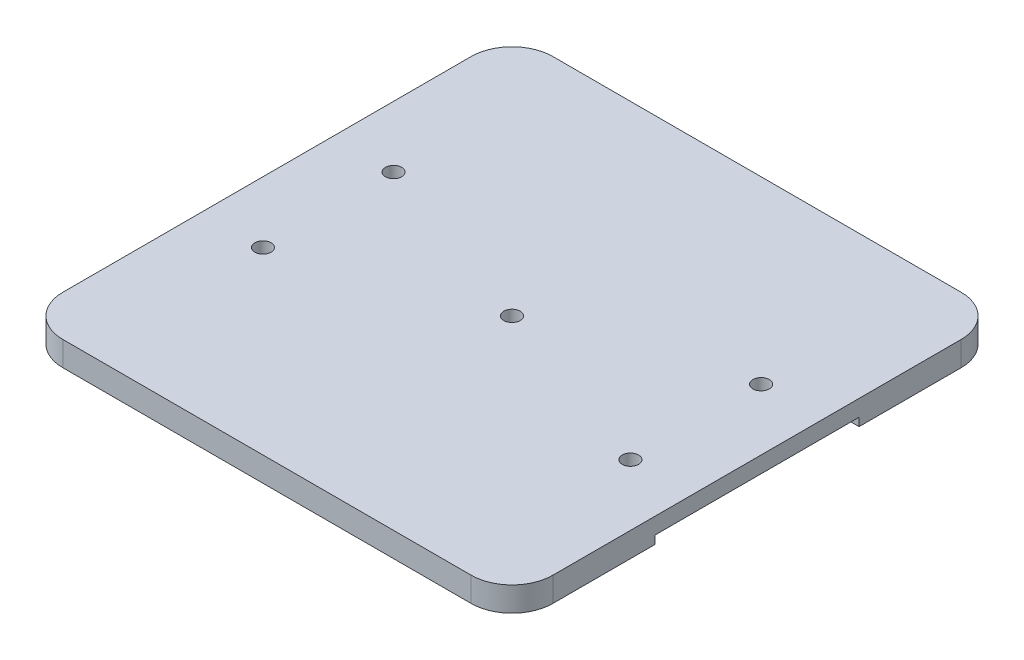
ISO-10303-21;
HEADER;
FILE_DESCRIPTION(('STEP AP214'),'2;1');
FILE_NAME('part.step','',(''),(''),'','','');
FILE_SCHEMA(('AUTOMOTIVE_DESIGN { 1 0 10303 214 1 1 1 1 }'));
ENDSEC;
DATA;
#1=APPLICATION_CONTEXT('core data for automotive mechanical design processes');
#2=APPLICATION_PROTOCOL_DEFINITION('international standard','automotive_design',2000,#1);
#3=PRODUCT_CONTEXT('',#1,'mechanical');
#4=PRODUCT('Part','Part','',(#3));
#5=PRODUCT_RELATED_PRODUCT_CATEGORY('part','',(#4));
#6=PRODUCT_DEFINITION_FORMATION('','',#4);
#7=PRODUCT_DEFINITION_CONTEXT('part definition',#1,'design');
#8=PRODUCT_DEFINITION('design','',#6,#7);
#9=PRODUCT_DEFINITION_SHAPE('','',#8);
#10=(LENGTH_UNIT() NAMED_UNIT(*) SI_UNIT(.MILLI.,.METRE.));
#11=(NAMED_UNIT(*) PLANE_ANGLE_UNIT() SI_UNIT($,.RADIAN.));
#12=(NAMED_UNIT(*) SI_UNIT($,.STERADIAN.) SOLID_ANGLE_UNIT());
#13=UNCERTAINTY_MEASURE_WITH_UNIT(LENGTH_MEASURE(1.E-05),#10,'distance_accuracy_value','');
#14=(GEOMETRIC_REPRESENTATION_CONTEXT(3) GLOBAL_UNCERTAINTY_ASSIGNED_CONTEXT((#13)) GLOBAL_UNIT_ASSIGNED_CONTEXT((#10,
#11,#12)) REPRESENTATION_CONTEXT('',''));
#15=CARTESIAN_POINT('',(0.,0.,0.));
#16=DIRECTION('',(0.,0.,1.));
#17=DIRECTION('',(1.,0.,0.));
#18=AXIS2_PLACEMENT_3D('',#15,#16,#17);
#19=CARTESIAN_POINT('',(-37.0588235294118,3.,-12.8235294117647));
#20=DIRECTION('',(1.,0.,0.));
#21=DIRECTION('',(0.,0.,-1.));
#22=AXIS2_PLACEMENT_3D('',#19,#20,#21);
#23=PLANE('',#22);
#24=DIRECTION('',(0.,-1.,0.));
#25=VECTOR('',#24,1.);
#26=CARTESIAN_POINT('',(-37.0588235294118,1.,24.6764705882353));
#27=LINE('',#26,#25);
#28=CARTESIAN_POINT('',(-37.0588235294118,1.,24.6764705882353));
#29=VERTEX_POINT('',#28);
#30=CARTESIAN_POINT('',(-37.0588235294118,0.,24.6764705882353));
#31=VERTEX_POINT('',#30);
#32=EDGE_CURVE('E172',#29,#31,#27,.T.);
#33=ORIENTED_EDGE('',*,*,#32,.T.);
#34=DIRECTION('',(0.,0.,1.));
#35=VECTOR('',#34,1.);
#36=CARTESIAN_POINT('',(-37.0588235294118,0.,-12.8235294117647));
#37=LINE('',#36,#35);
#38=CARTESIAN_POINT('',(-37.0588235294118,0.,37.1764705882353));
#39=VERTEX_POINT('',#38);
#40=EDGE_CURVE('E284',#31,#39,#37,.T.);
#41=ORIENTED_EDGE('',*,*,#40,.T.);
#42=DIRECTION('',(0.,-1.,0.));
#43=VECTOR('',#42,1.);
#44=CARTESIAN_POINT('',(-37.0588235294118,3.,37.1764705882353));
#45=LINE('',#44,#43);
#46=CARTESIAN_POINT('',(-37.0588235294118,3.,37.1764705882353));
#47=VERTEX_POINT('',#46);
#48=EDGE_CURVE('E316',#47,#39,#45,.T.);
#49=ORIENTED_EDGE('',*,*,#48,.F.);
#50=DIRECTION('',(0.,0.,1.));
#51=VECTOR('',#50,1.);
#52=CARTESIAN_POINT('',(-37.0588235294118,3.,-12.8235294117647));
#53=LINE('',#52,#51);
#54=CARTESIAN_POINT('',(-37.0588235294118,3.,-12.8235294117647));
#55=VERTEX_POINT('',#54);
#56=EDGE_CURVE('E259',#55,#47,#53,.T.);
#57=ORIENTED_EDGE('',*,*,#56,.F.);
#58=DIRECTION('',(0.,-1.,0.));
#59=VECTOR('',#58,1.);
#60=CARTESIAN_POINT('',(-37.0588235294118,3.,-12.8235294117647));
#61=LINE('',#60,#59);
#62=CARTESIAN_POINT('',(-37.0588235294118,0.,-12.8235294117647));
#63=VERTEX_POINT('',#62);
#64=EDGE_CURVE('E320',#55,#63,#61,.T.);
#65=ORIENTED_EDGE('',*,*,#64,.T.);
#66=CARTESIAN_POINT('',(-37.0588235294118,0.,-0.323529411764702));
#67=VERTEX_POINT('',#66);
#68=EDGE_CURVE('E285',#63,#67,#37,.T.);
#69=ORIENTED_EDGE('',*,*,#68,.T.);
#70=DIRECTION('',(0.,-1.,0.));
#71=VECTOR('',#70,1.);
#72=CARTESIAN_POINT('',(-37.0588235294118,1.,-0.323529411764702));
#73=LINE('',#72,#71);
#74=CARTESIAN_POINT('',(-37.0588235294118,1.,-0.323529411764702));
#75=VERTEX_POINT('',#74);
#76=EDGE_CURVE('E67',#75,#67,#73,.T.);
#77=ORIENTED_EDGE('',*,*,#76,.F.);
#78=DIRECTION('',(0.,0.,1.));
#79=VECTOR('',#78,1.);
#80=CARTESIAN_POINT('',(-37.0588235294118,1.,-0.323529411764702));
#81=LINE('',#80,#79);
#82=EDGE_CURVE('E165',#75,#29,#81,.T.);
#83=ORIENTED_EDGE('',*,*,#82,.T.);
#84=EDGE_LOOP('',(#33,#41,#49,#57,#65,#69,#77,#83));
#85=FACE_BOUND('',#84,.T.);
#86=ADVANCED_FACE('F43',(#85),#23,.F.);
#87=CARTESIAN_POINT('',(22.9411764705882,3.,-12.8235294117647));
#88=DIRECTION('',(-1.,0.,0.));
#89=DIRECTION('',(0.,0.,1.));
#90=AXIS2_PLACEMENT_3D('',#87,#88,#89);
#91=PLANE('',#90);
#92=DIRECTION('',(0.,-1.,0.));
#93=VECTOR('',#92,1.);
#94=CARTESIAN_POINT('',(22.9411764705882,1.,24.6764705882353));
#95=LINE('',#94,#93);
#96=CARTESIAN_POINT('',(22.9411764705882,1.,24.6764705882353));
#97=VERTEX_POINT('',#96);
#98=CARTESIAN_POINT('',(22.9411764705882,0.,24.6764705882353));
#99=VERTEX_POINT('',#98);
#100=EDGE_CURVE('E213',#97,#99,#95,.T.);
#101=ORIENTED_EDGE('',*,*,#100,.F.);
#102=DIRECTION('',(0.,0.,-1.));
#103=VECTOR('',#102,1.);
#104=CARTESIAN_POINT('',(22.9411764705882,1.,-0.323529411764702));
#105=LINE('',#104,#103);
#106=CARTESIAN_POINT('',(22.9411764705882,1.,-0.323529411764702));
#107=VERTEX_POINT('',#106);
#108=EDGE_CURVE('E238',#97,#107,#105,.T.);
#109=ORIENTED_EDGE('',*,*,#108,.T.);
#110=DIRECTION('',(0.,-1.,0.));
#111=VECTOR('',#110,1.);
#112=CARTESIAN_POINT('',(22.9411764705882,1.,-0.323529411764702));
#113=LINE('',#112,#111);
#114=CARTESIAN_POINT('',(22.9411764705882,0.,-0.323529411764702));
#115=VERTEX_POINT('',#114);
#116=EDGE_CURVE('E217',#107,#115,#113,.T.);
#117=ORIENTED_EDGE('',*,*,#116,.T.);
#118=DIRECTION('',(0.,0.,-1.));
#119=VECTOR('',#118,1.);
#120=CARTESIAN_POINT('',(22.9411764705882,0.,-12.8235294117647));
#121=LINE('',#120,#119);
#122=CARTESIAN_POINT('',(22.9411764705882,0.,-12.8235294117647));
#123=VERTEX_POINT('',#122);
#124=EDGE_CURVE('E297',#115,#123,#121,.T.);
#125=ORIENTED_EDGE('',*,*,#124,.T.);
#126=DIRECTION('',(0.,-1.,0.));
#127=VECTOR('',#126,1.);
#128=CARTESIAN_POINT('',(22.9411764705882,3.,-12.8235294117647));
#129=LINE('',#128,#127);
#130=CARTESIAN_POINT('',(22.9411764705882,3.,-12.8235294117647));
#131=VERTEX_POINT('',#130);
#132=EDGE_CURVE('E274',#131,#123,#129,.T.);
#133=ORIENTED_EDGE('',*,*,#132,.F.);
#134=DIRECTION('',(0.,0.,-1.));
#135=VECTOR('',#134,1.);
#136=CARTESIAN_POINT('',(22.9411764705882,3.,-12.8235294117647));
#137=LINE('',#136,#135);
#138=CARTESIAN_POINT('',(22.9411764705882,3.,37.1764705882353));
#139=VERTEX_POINT('',#138);
#140=EDGE_CURVE('E271',#139,#131,#137,.T.);
#141=ORIENTED_EDGE('',*,*,#140,.F.);
#142=DIRECTION('',(0.,-1.,0.));
#143=VECTOR('',#142,1.);
#144=CARTESIAN_POINT('',(22.9411764705882,3.,37.1764705882353));
#145=LINE('',#144,#143);
#146=CARTESIAN_POINT('',(22.9411764705882,0.,37.1764705882353));
#147=VERTEX_POINT('',#146);
#148=EDGE_CURVE('E304',#139,#147,#145,.T.);
#149=ORIENTED_EDGE('',*,*,#148,.T.);
#150=EDGE_CURVE('E253',#147,#99,#121,.T.);
#151=ORIENTED_EDGE('',*,*,#150,.T.);
#152=EDGE_LOOP('',(#101,#109,#117,#125,#133,#141,#149,#151));
#153=FACE_BOUND('',#152,.T.);
#154=ADVANCED_FACE('F367',(#153),#91,.F.);
#155=CARTESIAN_POINT('',(17.9411764705882,0.,-12.8235294117647));
#156=DIRECTION('',(0.,-1.,0.));
#157=DIRECTION('',(0.,0.,-1.));
#158=AXIS2_PLACEMENT_3D('',#155,#156,#157);
#159=PLANE('',#158);
#160=CARTESIAN_POINT('',(-7.05882352941178,0.,12.1764705882353));
#161=DIRECTION('',(0.,-1.,0.));
#162=DIRECTION('',(0.,0.,-1.));
#163=AXIS2_PLACEMENT_3D('',#160,#161,#162);
#164=CIRCLE('',#163,1.);
#165=CARTESIAN_POINT('',(-7.05882352941178,0.,11.1764705882353));
#166=VERTEX_POINT('',#165);
#167=EDGE_CURVE('E644',#166,#166,#164,.T.);
#168=ORIENTED_EDGE('',*,*,#167,.F.);
#169=EDGE_LOOP('',(#168));
#170=FACE_BOUND('',#169,.T.);
#171=ORIENTED_EDGE('',*,*,#40,.F.);
#172=DIRECTION('',(1.,0.,0.));
#173=VECTOR('',#172,1.);
#174=CARTESIAN_POINT('',(-37.0588235294118,0.,24.6764705882353));
#175=LINE('',#174,#173);
#176=CARTESIAN_POINT('',(-22.0588235294118,0.,24.6764705882353));
#177=VERTEX_POINT('',#176);
#178=EDGE_CURVE('E175',#31,#177,#175,.T.);
#179=ORIENTED_EDGE('',*,*,#178,.T.);
#180=DIRECTION('',(0.,0.,-1.));
#181=VECTOR('',#180,1.);
#182=CARTESIAN_POINT('',(-22.0588235294118,0.,-0.323529411764702));
#183=LINE('',#182,#181);
#184=CARTESIAN_POINT('',(-22.0588235294118,0.,-0.323529411764702));
#185=VERTEX_POINT('',#184);
#186=EDGE_CURVE('E187',#177,#185,#183,.T.);
#187=ORIENTED_EDGE('',*,*,#186,.T.);
#188=DIRECTION('',(-1.,0.,0.));
#189=VECTOR('',#188,1.);
#190=CARTESIAN_POINT('',(-37.0588235294118,0.,-0.323529411764702));
#191=LINE('',#190,#189);
#192=EDGE_CURVE('E184',#185,#67,#191,.T.);
#193=ORIENTED_EDGE('',*,*,#192,.T.);
#194=ORIENTED_EDGE('',*,*,#68,.F.);
#195=CARTESIAN_POINT('',(-32.0588235294118,0.,-12.8235294117647));
#196=DIRECTION('',(0.,1.,0.));
#197=DIRECTION('',(0.,0.,1.));
#198=AXIS2_PLACEMENT_3D('',#195,#196,#197);
#199=CIRCLE('',#198,5.);
#200=CARTESIAN_POINT('',(-32.0588235294118,0.,-17.8235294117647));
#201=VERTEX_POINT('',#200);
#202=EDGE_CURVE('E281',#201,#63,#199,.T.);
#203=ORIENTED_EDGE('',*,*,#202,.F.);
#204=DIRECTION('',(-1.,0.,0.));
#205=VECTOR('',#204,1.);
#206=CARTESIAN_POINT('',(-32.0588235294118,0.,-17.8235294117647));
#207=LINE('',#206,#205);
#208=CARTESIAN_POINT('',(17.9411764705882,0.,-17.8235294117647));
#209=VERTEX_POINT('',#208);
#210=EDGE_CURVE('E278',#209,#201,#207,.T.);
#211=ORIENTED_EDGE('',*,*,#210,.F.);
#212=CARTESIAN_POINT('',(17.9411764705882,0.,-12.8235294117647));
#213=DIRECTION('',(0.,1.,0.));
#214=DIRECTION('',(0.,0.,-1.));
#215=AXIS2_PLACEMENT_3D('',#212,#213,#214);
#216=CIRCLE('',#215,5.);
#217=EDGE_CURVE('E179',#123,#209,#216,.T.);
#218=ORIENTED_EDGE('',*,*,#217,.F.);
#219=ORIENTED_EDGE('',*,*,#124,.F.);
#220=DIRECTION('',(-1.,0.,0.));
#221=VECTOR('',#220,1.);
#222=CARTESIAN_POINT('',(7.94117647058822,0.,-0.323529411764702));
#223=LINE('',#222,#221);
#224=CARTESIAN_POINT('',(7.94117647058822,0.,-0.323529411764702));
#225=VERTEX_POINT('',#224);
#226=EDGE_CURVE('E225',#115,#225,#223,.T.);
#227=ORIENTED_EDGE('',*,*,#226,.T.);
#228=DIRECTION('',(0.,0.,1.));
#229=VECTOR('',#228,1.);
#230=CARTESIAN_POINT('',(7.94117647058822,0.,-0.323529411764702));
#231=LINE('',#230,#229);
#232=CARTESIAN_POINT('',(7.94117647058823,0.,24.6764705882353));
#233=VERTEX_POINT('',#232);
#234=EDGE_CURVE('E59',#225,#233,#231,.T.);
#235=ORIENTED_EDGE('',*,*,#234,.T.);
#236=DIRECTION('',(1.,0.,0.));
#237=VECTOR('',#236,1.);
#238=CARTESIAN_POINT('',(7.94117647058823,0.,24.6764705882353));
#239=LINE('',#238,#237);
#240=EDGE_CURVE('E229',#233,#99,#239,.T.);
#241=ORIENTED_EDGE('',*,*,#240,.T.);
#242=ORIENTED_EDGE('',*,*,#150,.F.);
#243=CARTESIAN_POINT('',(17.9411764705882,0.,37.1764705882353));
#244=DIRECTION('',(0.,1.,0.));
#245=DIRECTION('',(0.,0.,1.));
#246=AXIS2_PLACEMENT_3D('',#243,#244,#245);
#247=CIRCLE('',#246,5.);
#248=CARTESIAN_POINT('',(17.9411764705882,0.,42.1764705882353));
#249=VERTEX_POINT('',#248);
#250=EDGE_CURVE('E294',#249,#147,#247,.T.);
#251=ORIENTED_EDGE('',*,*,#250,.F.);
#252=DIRECTION('',(1.,0.,0.));
#253=VECTOR('',#252,1.);
#254=CARTESIAN_POINT('',(-32.0588235294117,0.,42.1764705882353));
#255=LINE('',#254,#253);
#256=CARTESIAN_POINT('',(-32.0588235294118,0.,42.1764705882353));
#257=VERTEX_POINT('',#256);
#258=EDGE_CURVE('E291',#257,#249,#255,.T.);
#259=ORIENTED_EDGE('',*,*,#258,.F.);
#260=CARTESIAN_POINT('',(-32.0588235294118,0.,37.1764705882353));
#261=DIRECTION('',(0.,1.,0.));
#262=DIRECTION('',(0.,0.,1.));
#263=AXIS2_PLACEMENT_3D('',#260,#261,#262);
#264=CIRCLE('',#263,5.);
#265=EDGE_CURVE('E288',#39,#257,#264,.T.);
#266=ORIENTED_EDGE('',*,*,#265,.F.);
#267=EDGE_LOOP('',(#171,#179,#187,#193,#194,#203,#211,#218,#219,#227,#235,#241,#242,#251,#259,#266));
#268=FACE_BOUND('',#267,.T.);
#269=ADVANCED_FACE('F334',(#170,#268),#159,.T.);
#270=CARTESIAN_POINT('',(17.9411764705882,3.,-12.8235294117647));
#271=DIRECTION('',(0.,-1.,0.));
#272=DIRECTION('',(0.,0.,-1.));
#273=AXIS2_PLACEMENT_3D('',#270,#271,#272);
#274=CYLINDRICAL_SURFACE('',#273,5.);
#275=ORIENTED_EDGE('',*,*,#217,.T.);
#276=DIRECTION('',(0.,-1.,0.));
#277=VECTOR('',#276,1.);
#278=CARTESIAN_POINT('',(17.9411764705882,3.,-17.8235294117647));
#279=LINE('',#278,#277);
#280=CARTESIAN_POINT('',(17.9411764705882,3.,-17.8235294117647));
#281=VERTEX_POINT('',#280);
#282=EDGE_CURVE('E11',#281,#209,#279,.T.);
#283=ORIENTED_EDGE('',*,*,#282,.F.);
#284=CARTESIAN_POINT('',(17.9411764705882,3.,-12.8235294117647));
#285=DIRECTION('',(0.,1.,0.));
#286=DIRECTION('',(0.,0.,-1.));
#287=AXIS2_PLACEMENT_3D('',#284,#285,#286);
#288=CIRCLE('',#287,5.);
#289=EDGE_CURVE('E248',#131,#281,#288,.T.);
#290=ORIENTED_EDGE('',*,*,#289,.F.);
#291=ORIENTED_EDGE('',*,*,#132,.T.);
#292=EDGE_LOOP('',(#275,#283,#290,#291));
#293=FACE_BOUND('',#292,.T.);
#294=ADVANCED_FACE('F45',(#293),#274,.T.);
#295=CARTESIAN_POINT('',(-32.0588235294118,3.,-17.8235294117647));
#296=DIRECTION('',(0.,0.,1.));
#297=DIRECTION('',(1.,0.,0.));
#298=AXIS2_PLACEMENT_3D('',#295,#296,#297);
#299=PLANE('',#298);
#300=ORIENTED_EDGE('',*,*,#210,.T.);
#301=DIRECTION('',(0.,-1.,0.));
#302=VECTOR('',#301,1.);
#303=CARTESIAN_POINT('',(-32.0588235294118,3.,-17.8235294117647));
#304=LINE('',#303,#302);
#305=CARTESIAN_POINT('',(-32.0588235294118,3.,-17.8235294117647));
#306=VERTEX_POINT('',#305);
#307=EDGE_CURVE('E52',#306,#201,#304,.T.);
#308=ORIENTED_EDGE('',*,*,#307,.F.);
#309=DIRECTION('',(-1.,0.,0.));
#310=VECTOR('',#309,1.);
#311=CARTESIAN_POINT('',(-32.0588235294118,3.,-17.8235294117647));
#312=LINE('',#311,#310);
#313=EDGE_CURVE('E252',#281,#306,#312,.T.);
#314=ORIENTED_EDGE('',*,*,#313,.F.);
#315=ORIENTED_EDGE('',*,*,#282,.T.);
#316=EDGE_LOOP('',(#300,#308,#314,#315));
#317=FACE_BOUND('',#316,.T.);
#318=ADVANCED_FACE('F344',(#317),#299,.F.);
#319=CARTESIAN_POINT('',(-32.0588235294118,3.,-12.8235294117647));
#320=DIRECTION('',(0.,-1.,0.));
#321=DIRECTION('',(0.,0.,-1.));
#322=AXIS2_PLACEMENT_3D('',#319,#320,#321);
#323=CYLINDRICAL_SURFACE('',#322,5.);
#324=ORIENTED_EDGE('',*,*,#202,.T.);
#325=ORIENTED_EDGE('',*,*,#64,.F.);
#326=CARTESIAN_POINT('',(-32.0588235294118,3.,-12.8235294117647));
#327=DIRECTION('',(0.,1.,0.));
#328=DIRECTION('',(0.,0.,1.));
#329=AXIS2_PLACEMENT_3D('',#326,#327,#328);
#330=CIRCLE('',#329,5.);
#331=EDGE_CURVE('E256',#306,#55,#330,.T.);
#332=ORIENTED_EDGE('',*,*,#331,.F.);
#333=ORIENTED_EDGE('',*,*,#307,.T.);
#334=EDGE_LOOP('',(#324,#325,#332,#333));
#335=FACE_BOUND('',#334,.T.);
#336=ADVANCED_FACE('F329',(#335),#323,.T.);
#337=CARTESIAN_POINT('',(-32.0588235294118,3.,37.1764705882353));
#338=DIRECTION('',(0.,-1.,0.));
#339=DIRECTION('',(0.,0.,-1.));
#340=AXIS2_PLACEMENT_3D('',#337,#338,#339);
#341=CYLINDRICAL_SURFACE('',#340,5.);
#342=ORIENTED_EDGE('',*,*,#265,.T.);
#343=DIRECTION('',(0.,-1.,0.));
#344=VECTOR('',#343,1.);
#345=CARTESIAN_POINT('',(-32.0588235294118,3.,42.1764705882353));
#346=LINE('',#345,#344);
#347=CARTESIAN_POINT('',(-32.0588235294118,3.,42.1764705882353));
#348=VERTEX_POINT('',#347);
#349=EDGE_CURVE('E312',#348,#257,#346,.T.);
#350=ORIENTED_EDGE('',*,*,#349,.F.);
#351=CARTESIAN_POINT('',(-32.0588235294118,3.,37.1764705882353));
#352=DIRECTION('',(0.,1.,0.));
#353=DIRECTION('',(0.,0.,1.));
#354=AXIS2_PLACEMENT_3D('',#351,#352,#353);
#355=CIRCLE('',#354,5.);
#356=EDGE_CURVE('E262',#47,#348,#355,.T.);
#357=ORIENTED_EDGE('',*,*,#356,.F.);
#358=ORIENTED_EDGE('',*,*,#48,.T.);
#359=EDGE_LOOP('',(#342,#350,#357,#358));
#360=FACE_BOUND('',#359,.T.);
#361=ADVANCED_FACE('F353',(#360),#341,.T.);
#362=CARTESIAN_POINT('',(-32.0588235294117,3.,42.1764705882353));
#363=DIRECTION('',(0.,0.,-1.));
#364=DIRECTION('',(-1.,0.,0.));
#365=AXIS2_PLACEMENT_3D('',#362,#363,#364);
#366=PLANE('',#365);
#367=ORIENTED_EDGE('',*,*,#258,.T.);
#368=DIRECTION('',(0.,-1.,0.));
#369=VECTOR('',#368,1.);
#370=CARTESIAN_POINT('',(17.9411764705882,3.,42.1764705882353));
#371=LINE('',#370,#369);
#372=CARTESIAN_POINT('',(17.9411764705882,3.,42.1764705882353));
#373=VERTEX_POINT('',#372);
#374=EDGE_CURVE('E308',#373,#249,#371,.T.);
#375=ORIENTED_EDGE('',*,*,#374,.F.);
#376=DIRECTION('',(1.,0.,0.));
#377=VECTOR('',#376,1.);
#378=CARTESIAN_POINT('',(-32.0588235294117,3.,42.1764705882353));
#379=LINE('',#378,#377);
#380=EDGE_CURVE('E265',#348,#373,#379,.T.);
#381=ORIENTED_EDGE('',*,*,#380,.F.);
#382=ORIENTED_EDGE('',*,*,#349,.T.);
#383=EDGE_LOOP('',(#367,#375,#381,#382));
#384=FACE_BOUND('',#383,.T.);
#385=ADVANCED_FACE('F359',(#384),#366,.F.);
#386=CARTESIAN_POINT('',(17.9411764705882,3.,37.1764705882353));
#387=DIRECTION('',(0.,-1.,0.));
#388=DIRECTION('',(0.,0.,-1.));
#389=AXIS2_PLACEMENT_3D('',#386,#387,#388);
#390=CYLINDRICAL_SURFACE('',#389,5.);
#391=ORIENTED_EDGE('',*,*,#250,.T.);
#392=ORIENTED_EDGE('',*,*,#148,.F.);
#393=CARTESIAN_POINT('',(17.9411764705882,3.,37.1764705882353));
#394=DIRECTION('',(0.,1.,0.));
#395=DIRECTION('',(0.,0.,1.));
#396=AXIS2_PLACEMENT_3D('',#393,#394,#395);
#397=CIRCLE('',#396,5.);
#398=EDGE_CURVE('E268',#373,#139,#397,.T.);
#399=ORIENTED_EDGE('',*,*,#398,.F.);
#400=ORIENTED_EDGE('',*,*,#374,.T.);
#401=EDGE_LOOP('',(#391,#392,#399,#400));
#402=FACE_BOUND('',#401,.T.);
#403=ADVANCED_FACE('F363',(#402),#390,.T.);
#404=CARTESIAN_POINT('',(17.9411764705882,3.,-12.8235294117647));
#405=DIRECTION('',(0.,-1.,0.));
#406=DIRECTION('',(0.,0.,-1.));
#407=AXIS2_PLACEMENT_3D('',#404,#405,#406);
#408=PLANE('',#407);
#409=CARTESIAN_POINT('',(-7.05882352941178,3.,12.1764705882353));
#410=DIRECTION('',(0.,-1.,0.));
#411=DIRECTION('',(0.,0.,-1.));
#412=AXIS2_PLACEMENT_3D('',#409,#410,#411);
#413=CIRCLE('',#412,1.);
#414=CARTESIAN_POINT('',(-7.05882352941178,3.,11.1764705882353));
#415=VERTEX_POINT('',#414);
#416=EDGE_CURVE('E641',#415,#415,#413,.T.);
#417=ORIENTED_EDGE('',*,*,#416,.T.);
#418=EDGE_LOOP('',(#417));
#419=FACE_BOUND('',#418,.T.);
#420=CARTESIAN_POINT('',(-29.5588235294118,3.,4.1764705882353));
#421=DIRECTION('',(0.,-1.,0.));
#422=DIRECTION('',(0.,0.,-1.));
#423=AXIS2_PLACEMENT_3D('',#420,#421,#422);
#424=CIRCLE('',#423,1.);
#425=CARTESIAN_POINT('',(-29.5588235294118,3.,3.1764705882353));
#426=VERTEX_POINT('',#425);
#427=EDGE_CURVE('E651',#426,#426,#424,.T.);
#428=ORIENTED_EDGE('',*,*,#427,.T.);
#429=EDGE_LOOP('',(#428));
#430=FACE_BOUND('',#429,.T.);
#431=CARTESIAN_POINT('',(15.4411764705882,3.,20.1764705882353));
#432=DIRECTION('',(0.,-1.,0.));
#433=DIRECTION('',(0.,0.,-1.));
#434=AXIS2_PLACEMENT_3D('',#431,#432,#433);
#435=CIRCLE('',#434,1.);
#436=CARTESIAN_POINT('',(15.4411764705882,3.,19.1764705882353));
#437=VERTEX_POINT('',#436);
#438=EDGE_CURVE('E633',#437,#437,#435,.T.);
#439=ORIENTED_EDGE('',*,*,#438,.T.);
#440=EDGE_LOOP('',(#439));
#441=FACE_BOUND('',#440,.T.);
#442=CARTESIAN_POINT('',(15.4411764705882,3.,4.1764705882353));
#443=DIRECTION('',(0.,-1.,0.));
#444=DIRECTION('',(0.,0.,-1.));
#445=AXIS2_PLACEMENT_3D('',#442,#443,#444);
#446=CIRCLE('',#445,1.);
#447=CARTESIAN_POINT('',(15.4411764705882,3.,3.1764705882353));
#448=VERTEX_POINT('',#447);
#449=EDGE_CURVE('E634',#448,#448,#446,.T.);
#450=ORIENTED_EDGE('',*,*,#449,.T.);
#451=EDGE_LOOP('',(#450));
#452=FACE_BOUND('',#451,.T.);
#453=CARTESIAN_POINT('',(-29.5588235294118,3.,20.1764705882353));
#454=DIRECTION('',(0.,-1.,0.));
#455=DIRECTION('',(0.,0.,-1.));
#456=AXIS2_PLACEMENT_3D('',#453,#454,#455);
#457=CIRCLE('',#456,0.999999999999998);
#458=CARTESIAN_POINT('',(-29.5588235294118,3.,19.1764705882353));
#459=VERTEX_POINT('',#458);
#460=EDGE_CURVE('E214',#459,#459,#457,.T.);
#461=ORIENTED_EDGE('',*,*,#460,.T.);
#462=EDGE_LOOP('',(#461));
#463=FACE_BOUND('',#462,.T.);
#464=ORIENTED_EDGE('',*,*,#289,.T.);
#465=ORIENTED_EDGE('',*,*,#313,.T.);
#466=ORIENTED_EDGE('',*,*,#331,.T.);
#467=ORIENTED_EDGE('',*,*,#56,.T.);
#468=ORIENTED_EDGE('',*,*,#356,.T.);
#469=ORIENTED_EDGE('',*,*,#380,.T.);
#470=ORIENTED_EDGE('',*,*,#398,.T.);
#471=ORIENTED_EDGE('',*,*,#140,.T.);
#472=EDGE_LOOP('',(#464,#465,#466,#467,#468,#469,#470,#471));
#473=FACE_BOUND('',#472,.T.);
#474=ADVANCED_FACE('F340',(#419,#430,#441,#452,#463,#473),#408,.F.);
#475=CARTESIAN_POINT('',(7.94117647058822,1.,-0.323529411764702));
#476=DIRECTION('',(1.,0.,0.));
#477=DIRECTION('',(0.,0.,-1.));
#478=AXIS2_PLACEMENT_3D('',#475,#476,#477);
#479=PLANE('',#478);
#480=ORIENTED_EDGE('',*,*,#234,.F.);
#481=DIRECTION('',(0.,-1.,0.));
#482=VECTOR('',#481,1.);
#483=CARTESIAN_POINT('',(7.94117647058822,1.,-0.323529411764702));
#484=LINE('',#483,#482);
#485=CARTESIAN_POINT('',(7.94117647058822,1.,-0.323529411764702));
#486=VERTEX_POINT('',#485);
#487=EDGE_CURVE('E221',#486,#225,#484,.T.);
#488=ORIENTED_EDGE('',*,*,#487,.F.);
#489=DIRECTION('',(0.,0.,1.));
#490=VECTOR('',#489,1.);
#491=CARTESIAN_POINT('',(7.94117647058822,1.,-0.323529411764702));
#492=LINE('',#491,#490);
#493=CARTESIAN_POINT('',(7.94117647058823,1.,24.6764705882353));
#494=VERTEX_POINT('',#493);
#495=EDGE_CURVE('E230',#486,#494,#492,.T.);
#496=ORIENTED_EDGE('',*,*,#495,.T.);
#497=DIRECTION('',(0.,-1.,0.));
#498=VECTOR('',#497,1.);
#499=CARTESIAN_POINT('',(7.94117647058823,1.,24.6764705882353));
#500=LINE('',#499,#498);
#501=EDGE_CURVE('E210',#494,#233,#500,.T.);
#502=ORIENTED_EDGE('',*,*,#501,.T.);
#503=EDGE_LOOP('',(#480,#488,#496,#502));
#504=FACE_BOUND('',#503,.T.);
#505=ADVANCED_FACE('F413',(#504),#479,.T.);
#506=CARTESIAN_POINT('',(7.94117647058823,1.,24.6764705882353));
#507=DIRECTION('',(0.,0.,-1.));
#508=DIRECTION('',(-1.,0.,0.));
#509=AXIS2_PLACEMENT_3D('',#506,#507,#508);
#510=PLANE('',#509);
#511=ORIENTED_EDGE('',*,*,#240,.F.);
#512=ORIENTED_EDGE('',*,*,#501,.F.);
#513=DIRECTION('',(1.,0.,0.));
#514=VECTOR('',#513,1.);
#515=CARTESIAN_POINT('',(7.94117647058823,1.,24.6764705882353));
#516=LINE('',#515,#514);
#517=EDGE_CURVE('E242',#494,#97,#516,.T.);
#518=ORIENTED_EDGE('',*,*,#517,.T.);
#519=ORIENTED_EDGE('',*,*,#100,.T.);
#520=EDGE_LOOP('',(#511,#512,#518,#519));
#521=FACE_BOUND('',#520,.T.);
#522=ADVANCED_FACE('F498',(#521),#510,.T.);
#523=CARTESIAN_POINT('',(7.94117647058822,1.,-0.323529411764702));
#524=DIRECTION('',(0.,0.,1.));
#525=DIRECTION('',(1.,0.,0.));
#526=AXIS2_PLACEMENT_3D('',#523,#524,#525);
#527=PLANE('',#526);
#528=ORIENTED_EDGE('',*,*,#226,.F.);
#529=ORIENTED_EDGE('',*,*,#116,.F.);
#530=DIRECTION('',(-1.,0.,0.));
#531=VECTOR('',#530,1.);
#532=CARTESIAN_POINT('',(7.94117647058822,1.,-0.323529411764702));
#533=LINE('',#532,#531);
#534=EDGE_CURVE('E224',#107,#486,#533,.T.);
#535=ORIENTED_EDGE('',*,*,#534,.T.);
#536=ORIENTED_EDGE('',*,*,#487,.T.);
#537=EDGE_LOOP('',(#528,#529,#535,#536));
#538=FACE_BOUND('',#537,.T.);
#539=ADVANCED_FACE('F491',(#538),#527,.T.);
#540=CARTESIAN_POINT('',(0.,1.,0.));
#541=DIRECTION('',(0.,1.,0.));
#542=DIRECTION('',(0.,0.,1.));
#543=AXIS2_PLACEMENT_3D('',#540,#541,#542);
#544=PLANE('',#543);
#545=CARTESIAN_POINT('',(15.4411764705882,1.,20.1764705882353));
#546=DIRECTION('',(0.,-1.,0.));
#547=DIRECTION('',(0.,0.,-1.));
#548=AXIS2_PLACEMENT_3D('',#545,#546,#547);
#549=CIRCLE('',#548,1.);
#550=CARTESIAN_POINT('',(15.4411764705882,1.,19.1764705882353));
#551=VERTEX_POINT('',#550);
#552=EDGE_CURVE('E627',#551,#551,#549,.T.);
#553=ORIENTED_EDGE('',*,*,#552,.F.);
#554=EDGE_LOOP('',(#553));
#555=FACE_BOUND('',#554,.T.);
#556=CARTESIAN_POINT('',(15.4411764705882,1.,4.1764705882353));
#557=DIRECTION('',(0.,-1.,0.));
#558=DIRECTION('',(0.,0.,-1.));
#559=AXIS2_PLACEMENT_3D('',#556,#557,#558);
#560=CIRCLE('',#559,1.);
#561=CARTESIAN_POINT('',(15.4411764705882,1.,3.1764705882353));
#562=VERTEX_POINT('',#561);
#563=EDGE_CURVE('E630',#562,#562,#560,.T.);
#564=ORIENTED_EDGE('',*,*,#563,.F.);
#565=EDGE_LOOP('',(#564));
#566=FACE_BOUND('',#565,.T.);
#567=ORIENTED_EDGE('',*,*,#495,.F.);
#568=ORIENTED_EDGE('',*,*,#534,.F.);
#569=ORIENTED_EDGE('',*,*,#108,.F.);
#570=ORIENTED_EDGE('',*,*,#517,.F.);
#571=EDGE_LOOP('',(#567,#568,#569,#570));
#572=FACE_BOUND('',#571,.T.);
#573=ADVANCED_FACE('F484',(#555,#566,#572),#544,.F.);
#574=CARTESIAN_POINT('',(-37.0588235294118,1.,24.6764705882353));
#575=DIRECTION('',(0.,0.,-1.));
#576=DIRECTION('',(-1.,0.,0.));
#577=AXIS2_PLACEMENT_3D('',#574,#575,#576);
#578=PLANE('',#577);
#579=ORIENTED_EDGE('',*,*,#178,.F.);
#580=ORIENTED_EDGE('',*,*,#32,.F.);
#581=DIRECTION('',(1.,0.,0.));
#582=VECTOR('',#581,1.);
#583=CARTESIAN_POINT('',(-37.0588235294118,1.,24.6764705882353));
#584=LINE('',#583,#582);
#585=CARTESIAN_POINT('',(-22.0588235294118,1.,24.6764705882353));
#586=VERTEX_POINT('',#585);
#587=EDGE_CURVE('E160',#29,#586,#584,.T.);
#588=ORIENTED_EDGE('',*,*,#587,.T.);
#589=DIRECTION('',(0.,-1.,0.));
#590=VECTOR('',#589,1.);
#591=CARTESIAN_POINT('',(-22.0588235294118,1.,24.6764705882353));
#592=LINE('',#591,#590);
#593=EDGE_CURVE('E180',#586,#177,#592,.T.);
#594=ORIENTED_EDGE('',*,*,#593,.T.);
#595=EDGE_LOOP('',(#579,#580,#588,#594));
#596=FACE_BOUND('',#595,.T.);
#597=ADVANCED_FACE('F173',(#596),#578,.T.);
#598=CARTESIAN_POINT('',(-22.0588235294118,1.,-0.323529411764702));
#599=DIRECTION('',(-1.,0.,0.));
#600=DIRECTION('',(0.,0.,1.));
#601=AXIS2_PLACEMENT_3D('',#598,#599,#600);
#602=PLANE('',#601);
#603=ORIENTED_EDGE('',*,*,#186,.F.);
#604=ORIENTED_EDGE('',*,*,#593,.F.);
#605=DIRECTION('',(0.,0.,-1.));
#606=VECTOR('',#605,1.);
#607=CARTESIAN_POINT('',(-22.0588235294118,1.,-0.323529411764702));
#608=LINE('',#607,#606);
#609=CARTESIAN_POINT('',(-22.0588235294118,1.,-0.323529411764702));
#610=VERTEX_POINT('',#609);
#611=EDGE_CURVE('E166',#586,#610,#608,.T.);
#612=ORIENTED_EDGE('',*,*,#611,.T.);
#613=DIRECTION('',(0.,-1.,0.));
#614=VECTOR('',#613,1.);
#615=CARTESIAN_POINT('',(-22.0588235294118,1.,-0.323529411764702));
#616=LINE('',#615,#614);
#617=EDGE_CURVE('E205',#610,#185,#616,.T.);
#618=ORIENTED_EDGE('',*,*,#617,.T.);
#619=EDGE_LOOP('',(#603,#604,#612,#618));
#620=FACE_BOUND('',#619,.T.);
#621=ADVANCED_FACE('F470',(#620),#602,.T.);
#622=CARTESIAN_POINT('',(-37.0588235294118,1.,-0.323529411764702));
#623=DIRECTION('',(0.,0.,1.));
#624=DIRECTION('',(1.,0.,0.));
#625=AXIS2_PLACEMENT_3D('',#622,#623,#624);
#626=PLANE('',#625);
#627=ORIENTED_EDGE('',*,*,#192,.F.);
#628=ORIENTED_EDGE('',*,*,#617,.F.);
#629=DIRECTION('',(-1.,0.,0.));
#630=VECTOR('',#629,1.);
#631=CARTESIAN_POINT('',(-37.0588235294118,1.,-0.323529411764702));
#632=LINE('',#631,#630);
#633=EDGE_CURVE('E195',#610,#75,#632,.T.);
#634=ORIENTED_EDGE('',*,*,#633,.T.);
#635=ORIENTED_EDGE('',*,*,#76,.T.);
#636=EDGE_LOOP('',(#627,#628,#634,#635));
#637=FACE_BOUND('',#636,.T.);
#638=ADVANCED_FACE('F461',(#637),#626,.T.);
#639=CARTESIAN_POINT('',(0.,1.,0.));
#640=DIRECTION('',(0.,1.,0.));
#641=DIRECTION('',(0.,0.,1.));
#642=AXIS2_PLACEMENT_3D('',#639,#640,#641);
#643=PLANE('',#642);
#644=CARTESIAN_POINT('',(-29.5588235294118,1.,4.1764705882353));
#645=DIRECTION('',(0.,-1.,0.));
#646=DIRECTION('',(0.,0.,-1.));
#647=AXIS2_PLACEMENT_3D('',#644,#645,#646);
#648=CIRCLE('',#647,1.);
#649=CARTESIAN_POINT('',(-29.5588235294118,1.,3.1764705882353));
#650=VERTEX_POINT('',#649);
#651=EDGE_CURVE('E647',#650,#650,#648,.T.);
#652=ORIENTED_EDGE('',*,*,#651,.F.);
#653=EDGE_LOOP('',(#652));
#654=FACE_BOUND('',#653,.T.);
#655=CARTESIAN_POINT('',(-29.5588235294118,1.,20.1764705882353));
#656=DIRECTION('',(0.,-1.,0.));
#657=DIRECTION('',(0.,0.,-1.));
#658=AXIS2_PLACEMENT_3D('',#655,#656,#657);
#659=CIRCLE('',#658,0.999999999999998);
#660=CARTESIAN_POINT('',(-29.5588235294118,1.,19.1764705882353));
#661=VERTEX_POINT('',#660);
#662=EDGE_CURVE('E190',#661,#661,#659,.T.);
#663=ORIENTED_EDGE('',*,*,#662,.F.);
#664=EDGE_LOOP('',(#663));
#665=FACE_BOUND('',#664,.T.);
#666=ORIENTED_EDGE('',*,*,#82,.F.);
#667=ORIENTED_EDGE('',*,*,#633,.F.);
#668=ORIENTED_EDGE('',*,*,#611,.F.);
#669=ORIENTED_EDGE('',*,*,#587,.F.);
#670=EDGE_LOOP('',(#666,#667,#668,#669));
#671=FACE_BOUND('',#670,.T.);
#672=ADVANCED_FACE('F162',(#654,#665,#671),#643,.F.);
#673=CARTESIAN_POINT('',(-29.5588235294118,3.,20.1764705882353));
#674=DIRECTION('',(0.,-1.,0.));
#675=DIRECTION('',(0.,0.,-1.));
#676=AXIS2_PLACEMENT_3D('',#673,#674,#675);
#677=CYLINDRICAL_SURFACE('',#676,0.999999999999998);
#678=ORIENTED_EDGE('',*,*,#460,.F.);
#679=EDGE_LOOP('',(#678));
#680=FACE_BOUND('',#679,.T.);
#681=ORIENTED_EDGE('',*,*,#662,.T.);
#682=EDGE_LOOP('',(#681));
#683=FACE_BOUND('',#682,.T.);
#684=ADVANCED_FACE('F446',(#680,#683),#677,.F.);
#685=CARTESIAN_POINT('',(-29.5588235294118,3.,4.1764705882353));
#686=DIRECTION('',(0.,-1.,0.));
#687=DIRECTION('',(0.,0.,-1.));
#688=AXIS2_PLACEMENT_3D('',#685,#686,#687);
#689=CYLINDRICAL_SURFACE('',#688,1.);
#690=ORIENTED_EDGE('',*,*,#427,.F.);
#691=EDGE_LOOP('',(#690));
#692=FACE_BOUND('',#691,.T.);
#693=ORIENTED_EDGE('',*,*,#651,.T.);
#694=EDGE_LOOP('',(#693));
#695=FACE_BOUND('',#694,.T.);
#696=ADVANCED_FACE('F438',(#692,#695),#689,.F.);
#697=CARTESIAN_POINT('',(15.4411764705882,3.,4.1764705882353));
#698=DIRECTION('',(0.,-1.,0.));
#699=DIRECTION('',(0.,0.,-1.));
#700=AXIS2_PLACEMENT_3D('',#697,#698,#699);
#701=CYLINDRICAL_SURFACE('',#700,1.);
#702=ORIENTED_EDGE('',*,*,#449,.F.);
#703=EDGE_LOOP('',(#702));
#704=FACE_BOUND('',#703,.T.);
#705=ORIENTED_EDGE('',*,*,#563,.T.);
#706=EDGE_LOOP('',(#705));
#707=FACE_BOUND('',#706,.T.);
#708=ADVANCED_FACE('F433',(#704,#707),#701,.F.);
#709=CARTESIAN_POINT('',(15.4411764705882,3.,20.1764705882353));
#710=DIRECTION('',(0.,-1.,0.));
#711=DIRECTION('',(0.,0.,-1.));
#712=AXIS2_PLACEMENT_3D('',#709,#710,#711);
#713=CYLINDRICAL_SURFACE('',#712,1.);
#714=ORIENTED_EDGE('',*,*,#438,.F.);
#715=EDGE_LOOP('',(#714));
#716=FACE_BOUND('',#715,.T.);
#717=ORIENTED_EDGE('',*,*,#552,.T.);
#718=EDGE_LOOP('',(#717));
#719=FACE_BOUND('',#718,.T.);
#720=ADVANCED_FACE('F405',(#716,#719),#713,.F.);
#721=CARTESIAN_POINT('',(-7.05882352941178,3.,12.1764705882353));
#722=DIRECTION('',(0.,-1.,0.));
#723=DIRECTION('',(0.,0.,-1.));
#724=AXIS2_PLACEMENT_3D('',#721,#722,#723);
#725=CYLINDRICAL_SURFACE('',#724,1.);
#726=ORIENTED_EDGE('',*,*,#416,.F.);
#727=EDGE_LOOP('',(#726));
#728=FACE_BOUND('',#727,.T.);
#729=ORIENTED_EDGE('',*,*,#167,.T.);
#730=EDGE_LOOP('',(#729));
#731=FACE_BOUND('',#730,.T.);
#732=ADVANCED_FACE('F421',(#728,#731),#725,.F.);
#733=CLOSED_SHELL('',(#86,#154,#269,#294,#318,#336,#361,#385,#403,#474,#505,#522,#539,#573,#597,
#621,#638,#672,#684,#696,#708,#720,#732));
#734=MANIFOLD_SOLID_BREP('B2',#733);
#735=ADVANCED_BREP_SHAPE_REPRESENTATION('',(#18,#734),#14);
#736=SHAPE_DEFINITION_REPRESENTATION(#9,#735);
ENDSEC;
END-ISO-10303-21;
